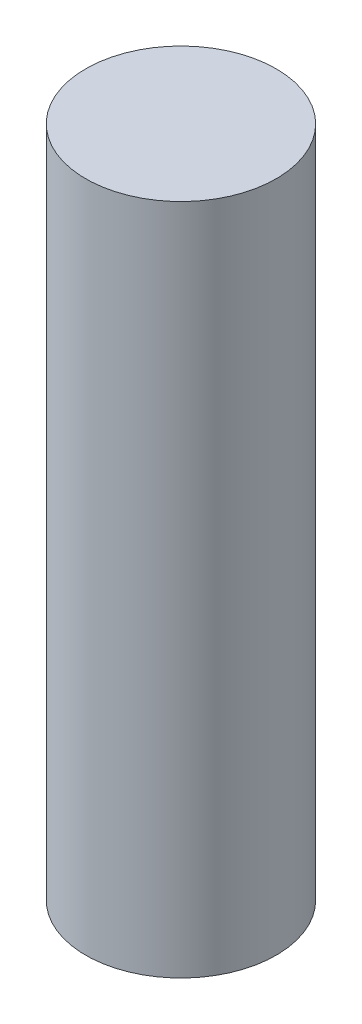
ISO-10303-21;
HEADER;
FILE_DESCRIPTION(('STEP AP214'),'2;1');
FILE_NAME('part.step','',(''),(''),'','','');
FILE_SCHEMA(('AUTOMOTIVE_DESIGN { 1 0 10303 214 1 1 1 1 }'));
ENDSEC;
DATA;
#1=APPLICATION_CONTEXT('core data for automotive mechanical design processes');
#2=APPLICATION_PROTOCOL_DEFINITION('international standard','automotive_design',2000,#1);
#3=PRODUCT_CONTEXT('',#1,'mechanical');
#4=PRODUCT('Part','Part','',(#3));
#5=PRODUCT_RELATED_PRODUCT_CATEGORY('part','',(#4));
#6=PRODUCT_DEFINITION_FORMATION('','',#4);
#7=PRODUCT_DEFINITION_CONTEXT('part definition',#1,'design');
#8=PRODUCT_DEFINITION('design','',#6,#7);
#9=PRODUCT_DEFINITION_SHAPE('','',#8);
#10=(LENGTH_UNIT() NAMED_UNIT(*) SI_UNIT(.MILLI.,.METRE.));
#11=(NAMED_UNIT(*) PLANE_ANGLE_UNIT() SI_UNIT($,.RADIAN.));
#12=(NAMED_UNIT(*) SI_UNIT($,.STERADIAN.) SOLID_ANGLE_UNIT());
#13=UNCERTAINTY_MEASURE_WITH_UNIT(LENGTH_MEASURE(1.E-05),#10,'distance_accuracy_value','');
#14=(GEOMETRIC_REPRESENTATION_CONTEXT(3) GLOBAL_UNCERTAINTY_ASSIGNED_CONTEXT((#13)) GLOBAL_UNIT_ASSIGNED_CONTEXT((#10,
#11,#12)) REPRESENTATION_CONTEXT('',''));
#15=CARTESIAN_POINT('',(0.,0.,0.));
#16=DIRECTION('',(0.,0.,1.));
#17=DIRECTION('',(1.,0.,0.));
#18=AXIS2_PLACEMENT_3D('',#15,#16,#17);
#19=CARTESIAN_POINT('',(0.,76.2,0.));
#20=DIRECTION('',(0.,-1.,0.));
#21=DIRECTION('',(0.,0.,-1.));
#22=AXIS2_PLACEMENT_3D('',#19,#20,#21);
#23=CYLINDRICAL_SURFACE('',#22,10.795);
#24=CARTESIAN_POINT('',(0.,76.2,0.));
#25=DIRECTION('',(0.,1.,0.));
#26=DIRECTION('',(0.,0.,1.));
#27=AXIS2_PLACEMENT_3D('',#24,#25,#26);
#28=CIRCLE('',#27,10.795);
#29=CARTESIAN_POINT('',(0.,76.2,-10.795));
#30=VERTEX_POINT('',#29);
#31=EDGE_CURVE('E10',#30,#30,#28,.T.);
#32=CARTESIAN_POINT('',(0.,0.,0.));
#33=DIRECTION('',(0.,1.,0.));
#34=DIRECTION('',(0.,0.,1.));
#35=AXIS2_PLACEMENT_3D('',#32,#33,#34);
#36=CIRCLE('',#35,10.795);
#37=CARTESIAN_POINT('',(0.,0.,-10.795));
#38=VERTEX_POINT('',#37);
#39=EDGE_CURVE('E46',#38,#38,#36,.T.);
#40=CARTESIAN_POINT('',(0.,76.2,-10.795));
#41=CARTESIAN_POINT('',(0.,75.40625,-10.795));
#42=CARTESIAN_POINT('',(0.,74.6125,-10.795));
#43=CARTESIAN_POINT('',(0.,73.025,-10.795));
#44=CARTESIAN_POINT('',(0.,72.23125,-10.795));
#45=CARTESIAN_POINT('',(0.,70.64375,-10.795));
#46=CARTESIAN_POINT('',(0.,69.85,-10.795));
#47=CARTESIAN_POINT('',(0.,68.2625,-10.795));
#48=CARTESIAN_POINT('',(0.,67.46875,-10.795));
#49=CARTESIAN_POINT('',(0.,65.88125,-10.795));
#50=CARTESIAN_POINT('',(0.,65.0875,-10.795));
#51=CARTESIAN_POINT('',(0.,63.5,-10.795));
#52=CARTESIAN_POINT('',(0.,62.70625,-10.795));
#53=CARTESIAN_POINT('',(0.,61.11875,-10.795));
#54=CARTESIAN_POINT('',(0.,60.325,-10.795));
#55=CARTESIAN_POINT('',(0.,58.7375,-10.795));
#56=CARTESIAN_POINT('',(0.,57.94375,-10.795));
#57=CARTESIAN_POINT('',(0.,56.35625,-10.795));
#58=CARTESIAN_POINT('',(0.,55.5625,-10.795));
#59=CARTESIAN_POINT('',(0.,53.975,-10.795));
#60=CARTESIAN_POINT('',(0.,53.18125,-10.795));
#61=CARTESIAN_POINT('',(0.,51.59375,-10.795));
#62=CARTESIAN_POINT('',(0.,50.8,-10.795));
#63=CARTESIAN_POINT('',(0.,49.2125,-10.795));
#64=CARTESIAN_POINT('',(0.,48.41875,-10.795));
#65=CARTESIAN_POINT('',(0.,46.83125,-10.795));
#66=CARTESIAN_POINT('',(0.,46.0375,-10.795));
#67=CARTESIAN_POINT('',(0.,44.45,-10.795));
#68=CARTESIAN_POINT('',(0.,43.65625,-10.795));
#69=CARTESIAN_POINT('',(0.,42.06875,-10.795));
#70=CARTESIAN_POINT('',(0.,41.275,-10.795));
#71=CARTESIAN_POINT('',(0.,39.6875,-10.795));
#72=CARTESIAN_POINT('',(0.,38.89375,-10.795));
#73=CARTESIAN_POINT('',(0.,37.30625,-10.795));
#74=CARTESIAN_POINT('',(0.,36.5125,-10.795));
#75=CARTESIAN_POINT('',(0.,34.925,-10.795));
#76=CARTESIAN_POINT('',(0.,34.13125,-10.795));
#77=CARTESIAN_POINT('',(0.,32.54375,-10.795));
#78=CARTESIAN_POINT('',(0.,31.75,-10.795));
#79=CARTESIAN_POINT('',(0.,30.1625,-10.795));
#80=CARTESIAN_POINT('',(0.,29.36875,-10.795));
#81=CARTESIAN_POINT('',(0.,27.78125,-10.795));
#82=CARTESIAN_POINT('',(0.,26.9875,-10.795));
#83=CARTESIAN_POINT('',(0.,25.4,-10.795));
#84=CARTESIAN_POINT('',(0.,24.60625,-10.795));
#85=CARTESIAN_POINT('',(0.,23.01875,-10.795));
#86=CARTESIAN_POINT('',(0.,22.225,-10.795));
#87=CARTESIAN_POINT('',(0.,20.6375,-10.795));
#88=CARTESIAN_POINT('',(0.,19.84375,-10.795));
#89=CARTESIAN_POINT('',(0.,18.25625,-10.795));
#90=CARTESIAN_POINT('',(0.,17.4625,-10.795));
#91=CARTESIAN_POINT('',(0.,15.875,-10.795));
#92=CARTESIAN_POINT('',(0.,15.08125,-10.795));
#93=CARTESIAN_POINT('',(0.,13.49375,-10.795));
#94=CARTESIAN_POINT('',(0.,12.7,-10.795));
#95=CARTESIAN_POINT('',(0.,11.1125,-10.795));
#96=CARTESIAN_POINT('',(0.,10.31875,-10.795));
#97=CARTESIAN_POINT('',(0.,8.73125,-10.795));
#98=CARTESIAN_POINT('',(0.,7.93750000000001,-10.795));
#99=CARTESIAN_POINT('',(0.,6.35,-10.795));
#100=CARTESIAN_POINT('',(0.,5.55625,-10.795));
#101=CARTESIAN_POINT('',(0.,3.96875,-10.795));
#102=CARTESIAN_POINT('',(0.,3.175,-10.795));
#103=CARTESIAN_POINT('',(0.,1.5875,-10.795));
#104=CARTESIAN_POINT('',(0.,0.793750000000001,-10.795));
#105=CARTESIAN_POINT('',(0.,0.,-10.795));
#106=B_SPLINE_CURVE_WITH_KNOTS('',3,(#40,#41,#42,#43,#44,#45,#46,#47,#48,#49,#50,#51,#52,#53,
#54,#55,#56,#57,#58,#59,#60,#61,#62,#63,#64,#65,#66,#67,#68,#69,#70,#71,#72,#73,#74,#75,#76,#77,
#78,#79,#80,#81,#82,#83,#84,#85,#86,#87,#88,#89,#90,#91,#92,#93,#94,#95,#96,#97,#98,#99,#100,
#101,#102,#103,#104,#105),.UNSPECIFIED.,.F.,.F.,(4,2,2,2,2,2,2,2,2,2,2,2,2,2,2,2,2,2,2,2,2,2,2,
2,2,2,2,2,2,2,2,2,4),(0.,2.38125,4.7625,7.14375,9.52500000000001,11.90625,14.2875,16.66875,
19.05,21.43125,23.8125,26.19375,28.575,30.95625,33.3375,35.71875,38.1,40.48125,42.8625,45.24375,
47.625,50.00625,52.3875,54.76875,57.15,59.53125,61.9125,64.29375,66.675,69.05625,71.4375,
73.81875,76.2),.UNSPECIFIED.);
#107=EDGE_CURVE('BSEAM43',#30,#38,#106,.T.);
#108=ORIENTED_EDGE('',*,*,#31,.F.);
#109=ORIENTED_EDGE('',*,*,#39,.T.);
#110=ORIENTED_EDGE('',*,*,#107,.T.);
#111=ORIENTED_EDGE('',*,*,#107,.F.);
#112=EDGE_LOOP('',(#108,#110,#109,#111));
#113=FACE_BOUND('',#112,.T.);
#114=ADVANCED_FACE('F43',(#113),#23,.T.);
#115=CARTESIAN_POINT('',(0.,76.2,0.));
#116=DIRECTION('',(0.,1.,0.));
#117=DIRECTION('',(0.,0.,1.));
#118=AXIS2_PLACEMENT_3D('',#115,#116,#117);
#119=PLANE('',#118);
#120=ORIENTED_EDGE('',*,*,#31,.T.);
#121=EDGE_LOOP('',(#120));
#122=FACE_BOUND('',#121,.T.);
#123=ADVANCED_FACE('F60',(#122),#119,.T.);
#124=CARTESIAN_POINT('',(0.,0.,0.));
#125=DIRECTION('',(0.,1.,0.));
#126=DIRECTION('',(0.,0.,1.));
#127=AXIS2_PLACEMENT_3D('',#124,#125,#126);
#128=PLANE('',#127);
#129=ORIENTED_EDGE('',*,*,#39,.F.);
#130=EDGE_LOOP('',(#129));
#131=FACE_BOUND('',#130,.T.);
#132=ADVANCED_FACE('F58',(#131),#128,.F.);
#133=CLOSED_SHELL('',(#114,#123,#132));
#134=MANIFOLD_SOLID_BREP('B2',#133);
#135=ADVANCED_BREP_SHAPE_REPRESENTATION('',(#18,#134),#14);
#136=SHAPE_DEFINITION_REPRESENTATION(#9,#135);
ENDSEC;
END-ISO-10303-21;
